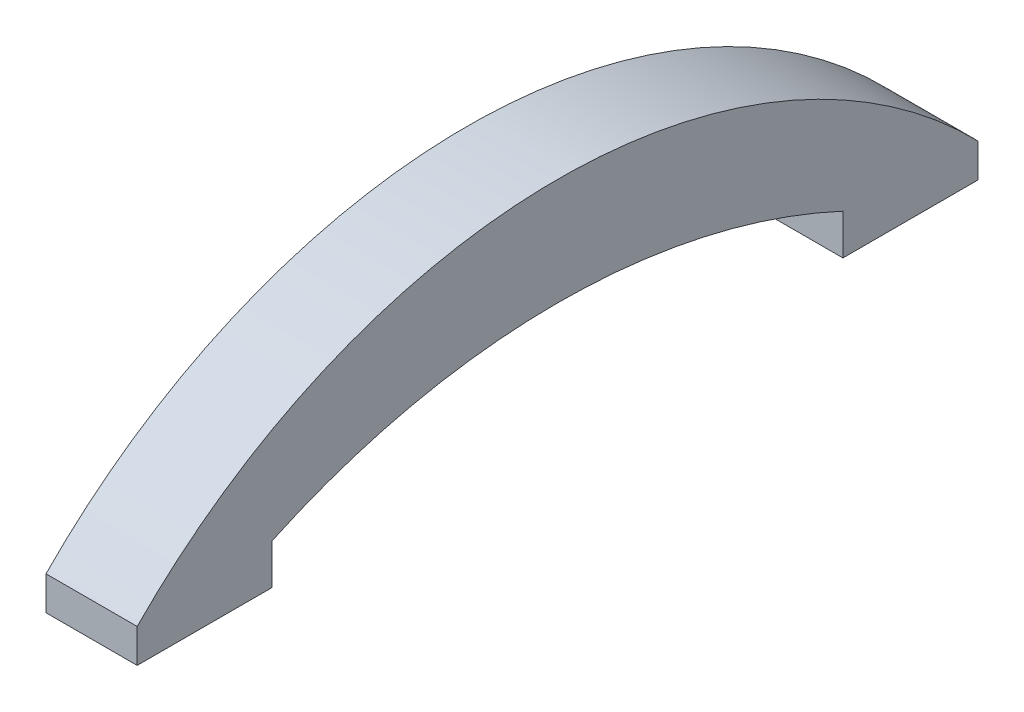
ISO-10303-21;
HEADER;
FILE_DESCRIPTION(('STEP AP214'),'2;1');
FILE_NAME('part.step','',(''),(''),'','','');
FILE_SCHEMA(('AUTOMOTIVE_DESIGN { 1 0 10303 214 1 1 1 1 }'));
ENDSEC;
DATA;
#1=APPLICATION_CONTEXT('core data for automotive mechanical design processes');
#2=APPLICATION_PROTOCOL_DEFINITION('international standard','automotive_design',2000,#1);
#3=PRODUCT_CONTEXT('',#1,'mechanical');
#4=PRODUCT('Part','Part','',(#3));
#5=PRODUCT_RELATED_PRODUCT_CATEGORY('part','',(#4));
#6=PRODUCT_DEFINITION_FORMATION('','',#4);
#7=PRODUCT_DEFINITION_CONTEXT('part definition',#1,'design');
#8=PRODUCT_DEFINITION('design','',#6,#7);
#9=PRODUCT_DEFINITION_SHAPE('','',#8);
#10=(LENGTH_UNIT() NAMED_UNIT(*) SI_UNIT(.MILLI.,.METRE.));
#11=(NAMED_UNIT(*) PLANE_ANGLE_UNIT() SI_UNIT($,.RADIAN.));
#12=(NAMED_UNIT(*) SI_UNIT($,.STERADIAN.) SOLID_ANGLE_UNIT());
#13=UNCERTAINTY_MEASURE_WITH_UNIT(LENGTH_MEASURE(1.E-05),#10,'distance_accuracy_value','');
#14=(GEOMETRIC_REPRESENTATION_CONTEXT(3) GLOBAL_UNCERTAINTY_ASSIGNED_CONTEXT((#13)) GLOBAL_UNIT_ASSIGNED_CONTEXT((#10,
#11,#12)) REPRESENTATION_CONTEXT('',''));
#15=CARTESIAN_POINT('',(0.,0.,0.));
#16=DIRECTION('',(0.,0.,1.));
#17=DIRECTION('',(1.,0.,0.));
#18=AXIS2_PLACEMENT_3D('',#15,#16,#17);
#19=CARTESIAN_POINT('',(27.,0.,124.5));
#20=DIRECTION('',(0.,1.,0.));
#21=DIRECTION('',(0.,0.,1.));
#22=AXIS2_PLACEMENT_3D('',#19,#20,#21);
#23=PLANE('',#22);
#24=DIRECTION('',(0.,0.,-1.));
#25=VECTOR('',#24,1.);
#26=CARTESIAN_POINT('',(0.,0.,124.5));
#27=LINE('',#26,#25);
#28=CARTESIAN_POINT('',(0.,0.,124.5));
#29=VERTEX_POINT('',#28);
#30=CARTESIAN_POINT('',(0.,0.,84.5));
#31=VERTEX_POINT('',#30);
#32=EDGE_CURVE('E239',#29,#31,#27,.T.);
#33=ORIENTED_EDGE('',*,*,#32,.T.);
#34=DIRECTION('',(-1.,0.,0.));
#35=VECTOR('',#34,1.);
#36=CARTESIAN_POINT('',(27.,0.,84.5));
#37=LINE('',#36,#35);
#38=CARTESIAN_POINT('',(27.,0.,84.5));
#39=VERTEX_POINT('',#38);
#40=EDGE_CURVE('E45',#39,#31,#37,.T.);
#41=ORIENTED_EDGE('',*,*,#40,.F.);
#42=DIRECTION('',(0.,0.,-1.));
#43=VECTOR('',#42,1.);
#44=CARTESIAN_POINT('',(27.,0.,124.5));
#45=LINE('',#44,#43);
#46=CARTESIAN_POINT('',(27.,0.,124.5));
#47=VERTEX_POINT('',#46);
#48=EDGE_CURVE('E221',#47,#39,#45,.T.);
#49=ORIENTED_EDGE('',*,*,#48,.F.);
#50=DIRECTION('',(-1.,0.,0.));
#51=VECTOR('',#50,1.);
#52=CARTESIAN_POINT('',(27.,0.,124.5));
#53=LINE('',#52,#51);
#54=EDGE_CURVE('E11',#47,#29,#53,.T.);
#55=ORIENTED_EDGE('',*,*,#54,.T.);
#56=EDGE_LOOP('',(#33,#41,#49,#55));
#57=FACE_BOUND('',#56,.T.);
#58=DIRECTION('',(1.,0.,0.));
#59=VECTOR('',#58,1.);
#60=CARTESIAN_POINT('',(1.75,0.,120.23));
#61=LINE('',#60,#59);
#62=CARTESIAN_POINT('',(1.75,0.,120.23));
#63=VERTEX_POINT('',#62);
#64=CARTESIAN_POINT('',(25.25,0.,120.23));
#65=VERTEX_POINT('',#64);
#66=EDGE_CURVE('E52',#63,#65,#61,.T.);
#67=ORIENTED_EDGE('',*,*,#66,.T.);
#68=DIRECTION('',(0.,0.,1.));
#69=VECTOR('',#68,1.);
#70=CARTESIAN_POINT('',(25.25,0.,85.7300000000001));
#71=LINE('',#70,#69);
#72=CARTESIAN_POINT('',(25.25,0.,85.7300000000001));
#73=VERTEX_POINT('',#72);
#74=EDGE_CURVE('E206',#73,#65,#71,.T.);
#75=ORIENTED_EDGE('',*,*,#74,.F.);
#76=DIRECTION('',(1.,0.,0.));
#77=VECTOR('',#76,1.);
#78=CARTESIAN_POINT('',(1.75,0.,85.7300000000001));
#79=LINE('',#78,#77);
#80=CARTESIAN_POINT('',(1.75,0.,85.7300000000001));
#81=VERTEX_POINT('',#80);
#82=EDGE_CURVE('E202',#81,#73,#79,.T.);
#83=ORIENTED_EDGE('',*,*,#82,.F.);
#84=DIRECTION('',(0.,0.,1.));
#85=VECTOR('',#84,1.);
#86=CARTESIAN_POINT('',(1.75,0.,85.7300000000001));
#87=LINE('',#86,#85);
#88=EDGE_CURVE('E199',#81,#63,#87,.T.);
#89=ORIENTED_EDGE('',*,*,#88,.T.);
#90=EDGE_LOOP('',(#67,#75,#83,#89));
#91=FACE_BOUND('',#90,.T.);
#92=ADVANCED_FACE('F37',(#57,#91),#23,.F.);
#93=CARTESIAN_POINT('',(27.,0.,-84.5));
#94=DIRECTION('',(0.,1.,0.));
#95=DIRECTION('',(0.,0.,1.));
#96=AXIS2_PLACEMENT_3D('',#93,#94,#95);
#97=PLANE('',#96);
#98=DIRECTION('',(0.,0.,-1.));
#99=VECTOR('',#98,1.);
#100=CARTESIAN_POINT('',(0.,0.,-84.5));
#101=LINE('',#100,#99);
#102=CARTESIAN_POINT('',(0.,0.,-84.5));
#103=VERTEX_POINT('',#102);
#104=CARTESIAN_POINT('',(0.,0.,-124.5));
#105=VERTEX_POINT('',#104);
#106=EDGE_CURVE('E247',#103,#105,#101,.T.);
#107=ORIENTED_EDGE('',*,*,#106,.T.);
#108=DIRECTION('',(-1.,0.,0.));
#109=VECTOR('',#108,1.);
#110=CARTESIAN_POINT('',(27.,0.,-124.5));
#111=LINE('',#110,#109);
#112=CARTESIAN_POINT('',(27.,0.,-124.5));
#113=VERTEX_POINT('',#112);
#114=EDGE_CURVE('E257',#113,#105,#111,.T.);
#115=ORIENTED_EDGE('',*,*,#114,.F.);
#116=DIRECTION('',(0.,0.,-1.));
#117=VECTOR('',#116,1.);
#118=CARTESIAN_POINT('',(27.,0.,-84.5));
#119=LINE('',#118,#117);
#120=CARTESIAN_POINT('',(27.,0.,-84.5));
#121=VERTEX_POINT('',#120);
#122=EDGE_CURVE('E230',#121,#113,#119,.T.);
#123=ORIENTED_EDGE('',*,*,#122,.F.);
#124=DIRECTION('',(-1.,0.,0.));
#125=VECTOR('',#124,1.);
#126=CARTESIAN_POINT('',(27.,0.,-84.5));
#127=LINE('',#126,#125);
#128=EDGE_CURVE('E260',#121,#103,#127,.T.);
#129=ORIENTED_EDGE('',*,*,#128,.T.);
#130=EDGE_LOOP('',(#107,#115,#123,#129));
#131=FACE_BOUND('',#130,.T.);
#132=DIRECTION('',(1.,0.,0.));
#133=VECTOR('',#132,1.);
#134=CARTESIAN_POINT('',(1.75,0.,-87.2499999999999));
#135=LINE('',#134,#133);
#136=CARTESIAN_POINT('',(1.75,0.,-87.2499999999999));
#137=VERTEX_POINT('',#136);
#138=CARTESIAN_POINT('',(25.25,0.,-87.2499999999999));
#139=VERTEX_POINT('',#138);
#140=EDGE_CURVE('E60',#137,#139,#135,.T.);
#141=ORIENTED_EDGE('',*,*,#140,.T.);
#142=DIRECTION('',(0.,0.,1.));
#143=VECTOR('',#142,1.);
#144=CARTESIAN_POINT('',(25.25,0.,-121.75));
#145=LINE('',#144,#143);
#146=CARTESIAN_POINT('',(25.25,0.,-121.75));
#147=VERTEX_POINT('',#146);
#148=EDGE_CURVE('E167',#147,#139,#145,.T.);
#149=ORIENTED_EDGE('',*,*,#148,.F.);
#150=DIRECTION('',(1.,0.,0.));
#151=VECTOR('',#150,1.);
#152=CARTESIAN_POINT('',(1.75,0.,-121.75));
#153=LINE('',#152,#151);
#154=CARTESIAN_POINT('',(1.75,0.,-121.75));
#155=VERTEX_POINT('',#154);
#156=EDGE_CURVE('E181',#155,#147,#153,.T.);
#157=ORIENTED_EDGE('',*,*,#156,.F.);
#158=DIRECTION('',(0.,0.,1.));
#159=VECTOR('',#158,1.);
#160=CARTESIAN_POINT('',(1.75,0.,-121.75));
#161=LINE('',#160,#159);
#162=EDGE_CURVE('E160',#155,#137,#161,.T.);
#163=ORIENTED_EDGE('',*,*,#162,.T.);
#164=EDGE_LOOP('',(#141,#149,#157,#163));
#165=FACE_BOUND('',#164,.T.);
#166=ADVANCED_FACE('F309',(#131,#165),#97,.F.);
#167=CARTESIAN_POINT('',(27.,0.,124.5));
#168=DIRECTION('',(0.,0.,-1.));
#169=DIRECTION('',(0.,1.,0.));
#170=AXIS2_PLACEMENT_3D('',#167,#168,#169);
#171=PLANE('',#170);
#172=DIRECTION('',(0.,-1.,0.));
#173=VECTOR('',#172,1.);
#174=CARTESIAN_POINT('',(0.,0.,124.5));
#175=LINE('',#174,#173);
#176=CARTESIAN_POINT('',(0.,9.99999999999999,124.5));
#177=VERTEX_POINT('',#176);
#178=EDGE_CURVE('E168',#177,#29,#175,.T.);
#179=ORIENTED_EDGE('',*,*,#178,.T.);
#180=ORIENTED_EDGE('',*,*,#54,.F.);
#181=DIRECTION('',(0.,-1.,0.));
#182=VECTOR('',#181,1.);
#183=CARTESIAN_POINT('',(27.,0.,124.5));
#184=LINE('',#183,#182);
#185=CARTESIAN_POINT('',(27.,9.99999999999999,124.5));
#186=VERTEX_POINT('',#185);
#187=EDGE_CURVE('E218',#186,#47,#184,.T.);
#188=ORIENTED_EDGE('',*,*,#187,.F.);
#189=DIRECTION('',(-1.,0.,0.));
#190=VECTOR('',#189,1.);
#191=CARTESIAN_POINT('',(27.,9.99999999999999,124.5));
#192=LINE('',#191,#190);
#193=EDGE_CURVE('E236',#186,#177,#192,.T.);
#194=ORIENTED_EDGE('',*,*,#193,.T.);
#195=EDGE_LOOP('',(#179,#180,#188,#194));
#196=FACE_BOUND('',#195,.T.);
#197=ADVANCED_FACE('F39',(#196),#171,.F.);
#198=CARTESIAN_POINT('',(27.,0.,84.5));
#199=DIRECTION('',(0.,0.,1.));
#200=DIRECTION('',(1.,0.,0.));
#201=AXIS2_PLACEMENT_3D('',#198,#199,#200);
#202=PLANE('',#201);
#203=DIRECTION('',(0.,1.,0.));
#204=VECTOR('',#203,1.);
#205=CARTESIAN_POINT('',(0.,0.,84.5));
#206=LINE('',#205,#204);
#207=CARTESIAN_POINT('',(0.,12.,84.5));
#208=VERTEX_POINT('',#207);
#209=EDGE_CURVE('E241',#31,#208,#206,.T.);
#210=ORIENTED_EDGE('',*,*,#209,.T.);
#211=DIRECTION('',(-1.,0.,0.));
#212=VECTOR('',#211,1.);
#213=CARTESIAN_POINT('',(27.,12.,84.5));
#214=LINE('',#213,#212);
#215=CARTESIAN_POINT('',(27.,12.,84.5));
#216=VERTEX_POINT('',#215);
#217=EDGE_CURVE('E266',#216,#208,#214,.T.);
#218=ORIENTED_EDGE('',*,*,#217,.F.);
#219=DIRECTION('',(0.,1.,0.));
#220=VECTOR('',#219,1.);
#221=CARTESIAN_POINT('',(27.,0.,84.5));
#222=LINE('',#221,#220);
#223=EDGE_CURVE('E224',#39,#216,#222,.T.);
#224=ORIENTED_EDGE('',*,*,#223,.F.);
#225=ORIENTED_EDGE('',*,*,#40,.T.);
#226=EDGE_LOOP('',(#210,#218,#224,#225));
#227=FACE_BOUND('',#226,.T.);
#228=ADVANCED_FACE('F273',(#227),#202,.F.);
#229=CARTESIAN_POINT('',(27.,-169.272584799798,0.));
#230=DIRECTION('',(-1.,0.,0.));
#231=DIRECTION('',(0.,0.,1.));
#232=AXIS2_PLACEMENT_3D('',#229,#230,#231);
#233=CYLINDRICAL_SURFACE('',#232,200.);
#234=CARTESIAN_POINT('',(0.,-169.272584799798,0.));
#235=DIRECTION('',(-1.,0.,0.));
#236=DIRECTION('',(0.,0.,1.));
#237=AXIS2_PLACEMENT_3D('',#234,#235,#236);
#238=CIRCLE('',#237,200.);
#239=CARTESIAN_POINT('',(0.,12.,-84.5));
#240=VERTEX_POINT('',#239);
#241=EDGE_CURVE('E243',#208,#240,#238,.T.);
#242=ORIENTED_EDGE('',*,*,#241,.T.);
#243=DIRECTION('',(-1.,0.,0.));
#244=VECTOR('',#243,1.);
#245=CARTESIAN_POINT('',(27.,12.,-84.5));
#246=LINE('',#245,#244);
#247=CARTESIAN_POINT('',(27.,12.,-84.5));
#248=VERTEX_POINT('',#247);
#249=EDGE_CURVE('E263',#248,#240,#246,.T.);
#250=ORIENTED_EDGE('',*,*,#249,.F.);
#251=CARTESIAN_POINT('',(27.,-169.272584799798,0.));
#252=DIRECTION('',(-1.,0.,0.));
#253=DIRECTION('',(0.,0.,1.));
#254=AXIS2_PLACEMENT_3D('',#251,#252,#253);
#255=CIRCLE('',#254,200.);
#256=EDGE_CURVE('E226',#216,#248,#255,.T.);
#257=ORIENTED_EDGE('',*,*,#256,.F.);
#258=ORIENTED_EDGE('',*,*,#217,.T.);
#259=EDGE_LOOP('',(#242,#250,#257,#258));
#260=FACE_BOUND('',#259,.T.);
#261=ADVANCED_FACE('F284',(#260),#233,.F.);
#262=CARTESIAN_POINT('',(27.,12.,-84.5));
#263=DIRECTION('',(0.,0.,-1.));
#264=DIRECTION('',(-1.,0.,0.));
#265=AXIS2_PLACEMENT_3D('',#262,#263,#264);
#266=PLANE('',#265);
#267=DIRECTION('',(0.,-1.,0.));
#268=VECTOR('',#267,1.);
#269=CARTESIAN_POINT('',(0.,12.,-84.5));
#270=LINE('',#269,#268);
#271=EDGE_CURVE('E245',#240,#103,#270,.T.);
#272=ORIENTED_EDGE('',*,*,#271,.T.);
#273=ORIENTED_EDGE('',*,*,#128,.F.);
#274=DIRECTION('',(0.,-1.,0.));
#275=VECTOR('',#274,1.);
#276=CARTESIAN_POINT('',(27.,12.,-84.5));
#277=LINE('',#276,#275);
#278=EDGE_CURVE('E228',#248,#121,#277,.T.);
#279=ORIENTED_EDGE('',*,*,#278,.F.);
#280=ORIENTED_EDGE('',*,*,#249,.T.);
#281=EDGE_LOOP('',(#272,#273,#279,#280));
#282=FACE_BOUND('',#281,.T.);
#283=ADVANCED_FACE('F288',(#282),#266,.F.);
#284=CARTESIAN_POINT('',(27.,10.,-124.5));
#285=DIRECTION('',(0.,0.,1.));
#286=DIRECTION('',(1.,0.,0.));
#287=AXIS2_PLACEMENT_3D('',#284,#285,#286);
#288=PLANE('',#287);
#289=DIRECTION('',(0.,1.,0.));
#290=VECTOR('',#289,1.);
#291=CARTESIAN_POINT('',(0.,10.,-124.5));
#292=LINE('',#291,#290);
#293=CARTESIAN_POINT('',(0.,10.,-124.5));
#294=VERTEX_POINT('',#293);
#295=EDGE_CURVE('E249',#105,#294,#292,.T.);
#296=ORIENTED_EDGE('',*,*,#295,.T.);
#297=DIRECTION('',(-1.,0.,0.));
#298=VECTOR('',#297,1.);
#299=CARTESIAN_POINT('',(27.,10.,-124.5));
#300=LINE('',#299,#298);
#301=CARTESIAN_POINT('',(27.,10.,-124.5));
#302=VERTEX_POINT('',#301);
#303=EDGE_CURVE('E254',#302,#294,#300,.T.);
#304=ORIENTED_EDGE('',*,*,#303,.F.);
#305=DIRECTION('',(0.,1.,0.));
#306=VECTOR('',#305,1.);
#307=CARTESIAN_POINT('',(27.,10.,-124.5));
#308=LINE('',#307,#306);
#309=EDGE_CURVE('E232',#113,#302,#308,.T.);
#310=ORIENTED_EDGE('',*,*,#309,.F.);
#311=ORIENTED_EDGE('',*,*,#114,.T.);
#312=EDGE_LOOP('',(#296,#304,#310,#311));
#313=FACE_BOUND('',#312,.T.);
#314=ADVANCED_FACE('F307',(#313),#288,.F.);
#315=CARTESIAN_POINT('',(27.,-111.626559335451,0.));
#316=DIRECTION('',(-1.,0.,0.));
#317=DIRECTION('',(0.,0.,1.));
#318=AXIS2_PLACEMENT_3D('',#315,#316,#317);
#319=CYLINDRICAL_SURFACE('',#318,174.049619177349);
#320=CARTESIAN_POINT('',(0.,-111.626559335451,0.));
#321=DIRECTION('',(1.,0.,0.));
#322=DIRECTION('',(0.,0.,1.));
#323=AXIS2_PLACEMENT_3D('',#320,#321,#322);
#324=CIRCLE('',#323,174.049619177349);
#325=EDGE_CURVE('E222',#294,#177,#324,.T.);
#326=ORIENTED_EDGE('',*,*,#325,.T.);
#327=ORIENTED_EDGE('',*,*,#193,.F.);
#328=CARTESIAN_POINT('',(27.,-111.626559335451,0.));
#329=DIRECTION('',(1.,0.,0.));
#330=DIRECTION('',(0.,0.,1.));
#331=AXIS2_PLACEMENT_3D('',#328,#329,#330);
#332=CIRCLE('',#331,174.049619177349);
#333=EDGE_CURVE('E234',#302,#186,#332,.T.);
#334=ORIENTED_EDGE('',*,*,#333,.F.);
#335=ORIENTED_EDGE('',*,*,#303,.T.);
#336=EDGE_LOOP('',(#326,#327,#334,#335));
#337=FACE_BOUND('',#336,.T.);
#338=ADVANCED_FACE('F302',(#337),#319,.T.);
#339=CARTESIAN_POINT('',(27.,-111.626559335451,0.));
#340=DIRECTION('',(-1.,0.,0.));
#341=DIRECTION('',(0.,0.,1.));
#342=AXIS2_PLACEMENT_3D('',#339,#340,#341);
#343=PLANE('',#342);
#344=ORIENTED_EDGE('',*,*,#187,.T.);
#345=ORIENTED_EDGE('',*,*,#48,.T.);
#346=ORIENTED_EDGE('',*,*,#223,.T.);
#347=ORIENTED_EDGE('',*,*,#256,.T.);
#348=ORIENTED_EDGE('',*,*,#278,.T.);
#349=ORIENTED_EDGE('',*,*,#122,.T.);
#350=ORIENTED_EDGE('',*,*,#309,.T.);
#351=ORIENTED_EDGE('',*,*,#333,.T.);
#352=EDGE_LOOP('',(#344,#345,#346,#347,#348,#349,#350,#351));
#353=FACE_BOUND('',#352,.T.);
#354=ADVANCED_FACE('F292',(#353),#343,.F.);
#355=CARTESIAN_POINT('',(0.,-111.626559335451,0.));
#356=DIRECTION('',(-1.,0.,0.));
#357=DIRECTION('',(0.,0.,1.));
#358=AXIS2_PLACEMENT_3D('',#355,#356,#357);
#359=PLANE('',#358);
#360=ORIENTED_EDGE('',*,*,#178,.F.);
#361=ORIENTED_EDGE('',*,*,#325,.F.);
#362=ORIENTED_EDGE('',*,*,#295,.F.);
#363=ORIENTED_EDGE('',*,*,#106,.F.);
#364=ORIENTED_EDGE('',*,*,#271,.F.);
#365=ORIENTED_EDGE('',*,*,#241,.F.);
#366=ORIENTED_EDGE('',*,*,#209,.F.);
#367=ORIENTED_EDGE('',*,*,#32,.F.);
#368=EDGE_LOOP('',(#360,#361,#362,#363,#364,#365,#366,#367));
#369=FACE_BOUND('',#368,.T.);
#370=ADVANCED_FACE('F279',(#369),#359,.T.);
#371=CARTESIAN_POINT('',(1.75,7.5,-87.2499999999999));
#372=DIRECTION('',(0.,0.,-1.));
#373=DIRECTION('',(-1.,0.,0.));
#374=AXIS2_PLACEMENT_3D('',#371,#372,#373);
#375=PLANE('',#374);
#376=ORIENTED_EDGE('',*,*,#140,.F.);
#377=DIRECTION('',(0.,-1.,0.));
#378=VECTOR('',#377,1.);
#379=CARTESIAN_POINT('',(1.75,7.5,-87.2499999999999));
#380=LINE('',#379,#378);
#381=CARTESIAN_POINT('',(1.75,7.5,-87.2499999999999));
#382=VERTEX_POINT('',#381);
#383=EDGE_CURVE('E155',#382,#137,#380,.T.);
#384=ORIENTED_EDGE('',*,*,#383,.F.);
#385=DIRECTION('',(1.,0.,0.));
#386=VECTOR('',#385,1.);
#387=CARTESIAN_POINT('',(1.75,7.5,-87.2499999999999));
#388=LINE('',#387,#386);
#389=CARTESIAN_POINT('',(25.25,7.5,-87.2499999999999));
#390=VERTEX_POINT('',#389);
#391=EDGE_CURVE('E150',#382,#390,#388,.T.);
#392=ORIENTED_EDGE('',*,*,#391,.T.);
#393=DIRECTION('',(0.,-1.,0.));
#394=VECTOR('',#393,1.);
#395=CARTESIAN_POINT('',(25.25,7.5,-87.2499999999999));
#396=LINE('',#395,#394);
#397=EDGE_CURVE('E153',#390,#139,#396,.T.);
#398=ORIENTED_EDGE('',*,*,#397,.T.);
#399=EDGE_LOOP('',(#376,#384,#392,#398));
#400=FACE_BOUND('',#399,.T.);
#401=ADVANCED_FACE('F152',(#400),#375,.T.);
#402=CARTESIAN_POINT('',(25.25,7.5,-121.75));
#403=DIRECTION('',(1.,0.,0.));
#404=DIRECTION('',(0.,0.,-1.));
#405=AXIS2_PLACEMENT_3D('',#402,#403,#404);
#406=PLANE('',#405);
#407=ORIENTED_EDGE('',*,*,#148,.T.);
#408=ORIENTED_EDGE('',*,*,#397,.F.);
#409=DIRECTION('',(0.,0.,1.));
#410=VECTOR('',#409,1.);
#411=CARTESIAN_POINT('',(25.25,7.5,-121.75));
#412=LINE('',#411,#410);
#413=CARTESIAN_POINT('',(25.25,7.5,-121.75));
#414=VERTEX_POINT('',#413);
#415=EDGE_CURVE('E159',#414,#390,#412,.T.);
#416=ORIENTED_EDGE('',*,*,#415,.F.);
#417=DIRECTION('',(0.,-1.,0.));
#418=VECTOR('',#417,1.);
#419=CARTESIAN_POINT('',(25.25,7.5,-121.75));
#420=LINE('',#419,#418);
#421=EDGE_CURVE('E169',#414,#147,#420,.T.);
#422=ORIENTED_EDGE('',*,*,#421,.T.);
#423=EDGE_LOOP('',(#407,#408,#416,#422));
#424=FACE_BOUND('',#423,.T.);
#425=ADVANCED_FACE('F164',(#424),#406,.F.);
#426=CARTESIAN_POINT('',(1.75,7.5,-121.75));
#427=DIRECTION('',(0.,0.,-1.));
#428=DIRECTION('',(-1.,0.,0.));
#429=AXIS2_PLACEMENT_3D('',#426,#427,#428);
#430=PLANE('',#429);
#431=ORIENTED_EDGE('',*,*,#156,.T.);
#432=ORIENTED_EDGE('',*,*,#421,.F.);
#433=DIRECTION('',(1.,0.,0.));
#434=VECTOR('',#433,1.);
#435=CARTESIAN_POINT('',(1.75,7.5,-121.75));
#436=LINE('',#435,#434);
#437=CARTESIAN_POINT('',(1.75,7.5,-121.75));
#438=VERTEX_POINT('',#437);
#439=EDGE_CURVE('E173',#438,#414,#436,.T.);
#440=ORIENTED_EDGE('',*,*,#439,.F.);
#441=DIRECTION('',(0.,-1.,0.));
#442=VECTOR('',#441,1.);
#443=CARTESIAN_POINT('',(1.75,7.5,-121.75));
#444=LINE('',#443,#442);
#445=EDGE_CURVE('E187',#438,#155,#444,.T.);
#446=ORIENTED_EDGE('',*,*,#445,.T.);
#447=EDGE_LOOP('',(#431,#432,#440,#446));
#448=FACE_BOUND('',#447,.T.);
#449=ADVANCED_FACE('F318',(#448),#430,.F.);
#450=CARTESIAN_POINT('',(1.75,7.5,-121.75));
#451=DIRECTION('',(1.,0.,0.));
#452=DIRECTION('',(0.,0.,-1.));
#453=AXIS2_PLACEMENT_3D('',#450,#451,#452);
#454=PLANE('',#453);
#455=ORIENTED_EDGE('',*,*,#162,.F.);
#456=ORIENTED_EDGE('',*,*,#445,.F.);
#457=DIRECTION('',(0.,0.,1.));
#458=VECTOR('',#457,1.);
#459=CARTESIAN_POINT('',(1.75,7.5,-121.75));
#460=LINE('',#459,#458);
#461=EDGE_CURVE('E175',#438,#382,#460,.T.);
#462=ORIENTED_EDGE('',*,*,#461,.T.);
#463=ORIENTED_EDGE('',*,*,#383,.T.);
#464=EDGE_LOOP('',(#455,#456,#462,#463));
#465=FACE_BOUND('',#464,.T.);
#466=ADVANCED_FACE('F316',(#465),#454,.T.);
#467=CARTESIAN_POINT('',(0.,7.5,0.));
#468=DIRECTION('',(0.,-1.,0.));
#469=DIRECTION('',(0.,0.,-1.));
#470=AXIS2_PLACEMENT_3D('',#467,#468,#469);
#471=PLANE('',#470);
#472=ORIENTED_EDGE('',*,*,#391,.F.);
#473=ORIENTED_EDGE('',*,*,#461,.F.);
#474=ORIENTED_EDGE('',*,*,#439,.T.);
#475=ORIENTED_EDGE('',*,*,#415,.T.);
#476=EDGE_LOOP('',(#472,#473,#474,#475));
#477=FACE_BOUND('',#476,.T.);
#478=ADVANCED_FACE('F171',(#477),#471,.T.);
#479=CARTESIAN_POINT('',(1.75,7.5,120.23));
#480=DIRECTION('',(0.,0.,-1.));
#481=DIRECTION('',(-1.,0.,0.));
#482=AXIS2_PLACEMENT_3D('',#479,#480,#481);
#483=PLANE('',#482);
#484=ORIENTED_EDGE('',*,*,#66,.F.);
#485=DIRECTION('',(0.,-1.,0.));
#486=VECTOR('',#485,1.);
#487=CARTESIAN_POINT('',(1.75,7.5,120.23));
#488=LINE('',#487,#486);
#489=CARTESIAN_POINT('',(1.75,7.5,120.23));
#490=VERTEX_POINT('',#489);
#491=EDGE_CURVE('E196',#490,#63,#488,.T.);
#492=ORIENTED_EDGE('',*,*,#491,.F.);
#493=DIRECTION('',(1.,0.,0.));
#494=VECTOR('',#493,1.);
#495=CARTESIAN_POINT('',(1.75,7.5,120.23));
#496=LINE('',#495,#494);
#497=CARTESIAN_POINT('',(25.25,7.5,120.23));
#498=VERTEX_POINT('',#497);
#499=EDGE_CURVE('E203',#490,#498,#496,.T.);
#500=ORIENTED_EDGE('',*,*,#499,.T.);
#501=DIRECTION('',(0.,-1.,0.));
#502=VECTOR('',#501,1.);
#503=CARTESIAN_POINT('',(25.25,7.5,120.23));
#504=LINE('',#503,#502);
#505=EDGE_CURVE('E190',#498,#65,#504,.T.);
#506=ORIENTED_EDGE('',*,*,#505,.T.);
#507=EDGE_LOOP('',(#484,#492,#500,#506));
#508=FACE_BOUND('',#507,.T.);
#509=ADVANCED_FACE('F360',(#508),#483,.T.);
#510=CARTESIAN_POINT('',(25.25,7.5,85.7300000000001));
#511=DIRECTION('',(1.,0.,0.));
#512=DIRECTION('',(0.,0.,-1.));
#513=AXIS2_PLACEMENT_3D('',#510,#511,#512);
#514=PLANE('',#513);
#515=ORIENTED_EDGE('',*,*,#74,.T.);
#516=ORIENTED_EDGE('',*,*,#505,.F.);
#517=DIRECTION('',(0.,0.,1.));
#518=VECTOR('',#517,1.);
#519=CARTESIAN_POINT('',(25.25,7.5,85.7300000000001));
#520=LINE('',#519,#518);
#521=CARTESIAN_POINT('',(25.25,7.5,85.7300000000001));
#522=VERTEX_POINT('',#521);
#523=EDGE_CURVE('E214',#522,#498,#520,.T.);
#524=ORIENTED_EDGE('',*,*,#523,.F.);
#525=DIRECTION('',(0.,-1.,0.));
#526=VECTOR('',#525,1.);
#527=CARTESIAN_POINT('',(25.25,7.5,85.7300000000001));
#528=LINE('',#527,#526);
#529=EDGE_CURVE('E192',#522,#73,#528,.T.);
#530=ORIENTED_EDGE('',*,*,#529,.T.);
#531=EDGE_LOOP('',(#515,#516,#524,#530));
#532=FACE_BOUND('',#531,.T.);
#533=ADVANCED_FACE('F356',(#532),#514,.F.);
#534=CARTESIAN_POINT('',(1.75,7.5,85.7300000000001));
#535=DIRECTION('',(0.,0.,-1.));
#536=DIRECTION('',(-1.,0.,0.));
#537=AXIS2_PLACEMENT_3D('',#534,#535,#536);
#538=PLANE('',#537);
#539=ORIENTED_EDGE('',*,*,#82,.T.);
#540=ORIENTED_EDGE('',*,*,#529,.F.);
#541=DIRECTION('',(1.,0.,0.));
#542=VECTOR('',#541,1.);
#543=CARTESIAN_POINT('',(1.75,7.5,85.7300000000001));
#544=LINE('',#543,#542);
#545=CARTESIAN_POINT('',(1.75,7.5,85.7300000000001));
#546=VERTEX_POINT('',#545);
#547=EDGE_CURVE('E211',#546,#522,#544,.T.);
#548=ORIENTED_EDGE('',*,*,#547,.F.);
#549=DIRECTION('',(0.,-1.,0.));
#550=VECTOR('',#549,1.);
#551=CARTESIAN_POINT('',(1.75,7.5,85.7300000000001));
#552=LINE('',#551,#550);
#553=EDGE_CURVE('E194',#546,#81,#552,.T.);
#554=ORIENTED_EDGE('',*,*,#553,.T.);
#555=EDGE_LOOP('',(#539,#540,#548,#554));
#556=FACE_BOUND('',#555,.T.);
#557=ADVANCED_FACE('F352',(#556),#538,.F.);
#558=CARTESIAN_POINT('',(1.75,7.5,85.7300000000001));
#559=DIRECTION('',(1.,0.,0.));
#560=DIRECTION('',(0.,0.,-1.));
#561=AXIS2_PLACEMENT_3D('',#558,#559,#560);
#562=PLANE('',#561);
#563=ORIENTED_EDGE('',*,*,#88,.F.);
#564=ORIENTED_EDGE('',*,*,#553,.F.);
#565=DIRECTION('',(0.,0.,1.));
#566=VECTOR('',#565,1.);
#567=CARTESIAN_POINT('',(1.75,7.5,85.7300000000001));
#568=LINE('',#567,#566);
#569=EDGE_CURVE('E198',#546,#490,#568,.T.);
#570=ORIENTED_EDGE('',*,*,#569,.T.);
#571=ORIENTED_EDGE('',*,*,#491,.T.);
#572=EDGE_LOOP('',(#563,#564,#570,#571));
#573=FACE_BOUND('',#572,.T.);
#574=ADVANCED_FACE('F348',(#573),#562,.T.);
#575=CARTESIAN_POINT('',(0.,7.5,0.));
#576=DIRECTION('',(0.,-1.,0.));
#577=DIRECTION('',(0.,0.,-1.));
#578=AXIS2_PLACEMENT_3D('',#575,#576,#577);
#579=PLANE('',#578);
#580=ORIENTED_EDGE('',*,*,#499,.F.);
#581=ORIENTED_EDGE('',*,*,#569,.F.);
#582=ORIENTED_EDGE('',*,*,#547,.T.);
#583=ORIENTED_EDGE('',*,*,#523,.T.);
#584=EDGE_LOOP('',(#580,#581,#582,#583));
#585=FACE_BOUND('',#584,.T.);
#586=ADVANCED_FACE('F345',(#585),#579,.T.);
#587=CLOSED_SHELL('',(#92,#166,#197,#228,#261,#283,#314,#338,#354,#370,#401,#425,#449,#466,#478,
#509,#533,#557,#574,#586));
#588=MANIFOLD_SOLID_BREP('B2',#587);
#589=ADVANCED_BREP_SHAPE_REPRESENTATION('',(#18,#588),#14);
#590=SHAPE_DEFINITION_REPRESENTATION(#9,#589);
ENDSEC;
END-ISO-10303-21;
